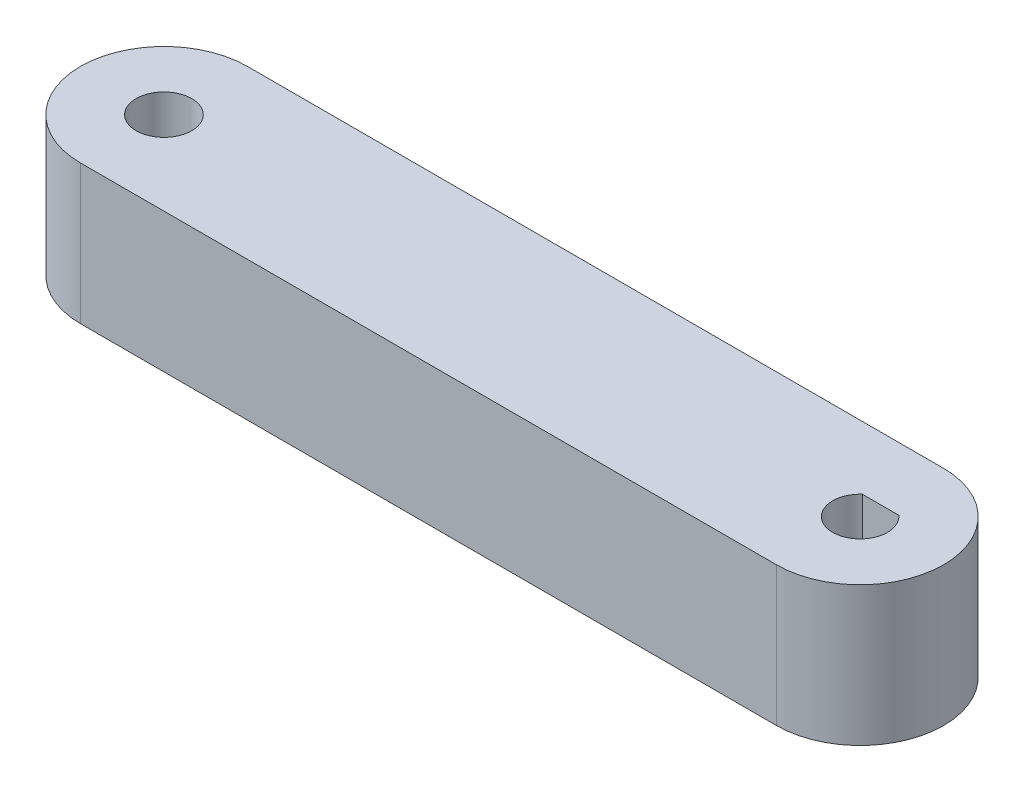
ISO-10303-21;
HEADER;
FILE_DESCRIPTION(('STEP AP214'),'2;1');
FILE_NAME('part.step','',(''),(''),'','','');
FILE_SCHEMA(('AUTOMOTIVE_DESIGN { 1 0 10303 214 1 1 1 1 }'));
ENDSEC;
DATA;
#1=APPLICATION_CONTEXT('core data for automotive mechanical design processes');
#2=APPLICATION_PROTOCOL_DEFINITION('international standard','automotive_design',2000,#1);
#3=PRODUCT_CONTEXT('',#1,'mechanical');
#4=PRODUCT('Part','Part','',(#3));
#5=PRODUCT_RELATED_PRODUCT_CATEGORY('part','',(#4));
#6=PRODUCT_DEFINITION_FORMATION('','',#4);
#7=PRODUCT_DEFINITION_CONTEXT('part definition',#1,'design');
#8=PRODUCT_DEFINITION('design','',#6,#7);
#9=PRODUCT_DEFINITION_SHAPE('','',#8);
#10=(LENGTH_UNIT() NAMED_UNIT(*) SI_UNIT(.MILLI.,.METRE.));
#11=(NAMED_UNIT(*) PLANE_ANGLE_UNIT() SI_UNIT($,.RADIAN.));
#12=(NAMED_UNIT(*) SI_UNIT($,.STERADIAN.) SOLID_ANGLE_UNIT());
#13=UNCERTAINTY_MEASURE_WITH_UNIT(LENGTH_MEASURE(1.E-05),#10,'distance_accuracy_value','');
#14=(GEOMETRIC_REPRESENTATION_CONTEXT(3) GLOBAL_UNCERTAINTY_ASSIGNED_CONTEXT((#13)) GLOBAL_UNIT_ASSIGNED_CONTEXT((#10,
#11,#12)) REPRESENTATION_CONTEXT('',''));
#15=CARTESIAN_POINT('',(0.,0.,0.));
#16=DIRECTION('',(0.,0.,1.));
#17=DIRECTION('',(1.,0.,0.));
#18=AXIS2_PLACEMENT_3D('',#15,#16,#17);
#19=CARTESIAN_POINT('',(-31.75,12.7,0.));
#20=DIRECTION('',(0.,1.,0.));
#21=DIRECTION('',(0.,0.,1.));
#22=AXIS2_PLACEMENT_3D('',#19,#20,#21);
#23=PLANE('',#22);
#24=CARTESIAN_POINT('',(-31.75,12.7,0.));
#25=DIRECTION('',(0.,1.,0.));
#26=DIRECTION('',(0.,0.,1.));
#27=AXIS2_PLACEMENT_3D('',#24,#25,#26);
#28=CIRCLE('',#27,2.54);
#29=CARTESIAN_POINT('',(-31.75,12.7,2.54));
#30=VERTEX_POINT('',#29);
#31=EDGE_CURVE('E106',#30,#30,#28,.T.);
#32=ORIENTED_EDGE('',*,*,#31,.F.);
#33=EDGE_LOOP('',(#32));
#34=FACE_BOUND('',#33,.T.);
#35=CARTESIAN_POINT('',(-31.75,12.7,0.));
#36=DIRECTION('',(0.,1.,0.));
#37=DIRECTION('',(0.,0.,1.));
#38=AXIS2_PLACEMENT_3D('',#35,#36,#37);
#39=CIRCLE('',#38,7.62);
#40=CARTESIAN_POINT('',(-31.75,12.7,-7.62));
#41=VERTEX_POINT('',#40);
#42=CARTESIAN_POINT('',(-31.75,12.7,7.62));
#43=VERTEX_POINT('',#42);
#44=EDGE_CURVE('E114',#41,#43,#39,.T.);
#45=ORIENTED_EDGE('',*,*,#44,.T.);
#46=DIRECTION('',(1.,0.,0.));
#47=VECTOR('',#46,1.);
#48=CARTESIAN_POINT('',(-31.75,12.7,7.62));
#49=LINE('',#48,#47);
#50=CARTESIAN_POINT('',(31.75,12.7,7.62));
#51=VERTEX_POINT('',#50);
#52=EDGE_CURVE('E117',#43,#51,#49,.T.);
#53=ORIENTED_EDGE('',*,*,#52,.T.);
#54=CARTESIAN_POINT('',(31.75,12.7,0.));
#55=DIRECTION('',(0.,1.,0.));
#56=DIRECTION('',(0.,0.,1.));
#57=AXIS2_PLACEMENT_3D('',#54,#55,#56);
#58=CIRCLE('',#57,7.62);
#59=CARTESIAN_POINT('',(31.75,12.7,-7.62));
#60=VERTEX_POINT('',#59);
#61=EDGE_CURVE('E120',#51,#60,#58,.T.);
#62=ORIENTED_EDGE('',*,*,#61,.T.);
#63=DIRECTION('',(-1.,0.,0.));
#64=VECTOR('',#63,1.);
#65=CARTESIAN_POINT('',(-31.75,12.7,-7.62));
#66=LINE('',#65,#64);
#67=EDGE_CURVE('E122',#60,#41,#66,.T.);
#68=ORIENTED_EDGE('',*,*,#67,.T.);
#69=EDGE_LOOP('',(#45,#53,#62,#68));
#70=FACE_BOUND('',#69,.T.);
#71=CARTESIAN_POINT('',(31.75,12.7,0.));
#72=DIRECTION('',(0.,1.,0.));
#73=DIRECTION('',(0.,0.,1.));
#74=AXIS2_PLACEMENT_3D('',#71,#72,#73);
#75=CIRCLE('',#74,2.5);
#76=CARTESIAN_POINT('',(30.0911825098418,12.7,-1.87038085275302));
#77=VERTEX_POINT('',#76);
#78=CARTESIAN_POINT('',(33.4088174901582,12.7,-1.87038085275302));
#79=VERTEX_POINT('',#78);
#80=EDGE_CURVE('E101',#77,#79,#75,.T.);
#81=ORIENTED_EDGE('',*,*,#80,.F.);
#82=DIRECTION('',(1.,0.,0.));
#83=VECTOR('',#82,1.);
#84=CARTESIAN_POINT('',(0.,12.7,-1.87038085275302));
#85=LINE('',#84,#83);
#86=EDGE_CURVE('E53',#77,#79,#85,.T.);
#87=ORIENTED_EDGE('',*,*,#86,.T.);
#88=EDGE_LOOP('',(#81,#87));
#89=FACE_BOUND('',#88,.T.);
#90=ADVANCED_FACE('F38',(#34,#70,#89),#23,.T.);
#91=CARTESIAN_POINT('',(-31.75,0.,0.));
#92=DIRECTION('',(0.,1.,0.));
#93=DIRECTION('',(0.,0.,1.));
#94=AXIS2_PLACEMENT_3D('',#91,#92,#93);
#95=PLANE('',#94);
#96=CARTESIAN_POINT('',(-31.75,0.,0.));
#97=DIRECTION('',(0.,1.,0.));
#98=DIRECTION('',(0.,0.,1.));
#99=AXIS2_PLACEMENT_3D('',#96,#97,#98);
#100=CIRCLE('',#99,7.62);
#101=CARTESIAN_POINT('',(-31.75,0.,-7.62));
#102=VERTEX_POINT('',#101);
#103=CARTESIAN_POINT('',(-31.75,0.,7.62));
#104=VERTEX_POINT('',#103);
#105=EDGE_CURVE('E111',#102,#104,#100,.T.);
#106=ORIENTED_EDGE('',*,*,#105,.F.);
#107=DIRECTION('',(-1.,0.,0.));
#108=VECTOR('',#107,1.);
#109=CARTESIAN_POINT('',(-31.75,0.,-7.62));
#110=LINE('',#109,#108);
#111=CARTESIAN_POINT('',(31.75,0.,-7.62));
#112=VERTEX_POINT('',#111);
#113=EDGE_CURVE('E118',#112,#102,#110,.T.);
#114=ORIENTED_EDGE('',*,*,#113,.F.);
#115=CARTESIAN_POINT('',(31.75,0.,0.));
#116=DIRECTION('',(0.,1.,0.));
#117=DIRECTION('',(0.,0.,1.));
#118=AXIS2_PLACEMENT_3D('',#115,#116,#117);
#119=CIRCLE('',#118,7.62);
#120=CARTESIAN_POINT('',(31.75,0.,7.62));
#121=VERTEX_POINT('',#120);
#122=EDGE_CURVE('E129',#121,#112,#119,.T.);
#123=ORIENTED_EDGE('',*,*,#122,.F.);
#124=DIRECTION('',(1.,0.,0.));
#125=VECTOR('',#124,1.);
#126=CARTESIAN_POINT('',(-31.75,0.,7.62));
#127=LINE('',#126,#125);
#128=EDGE_CURVE('E127',#104,#121,#127,.T.);
#129=ORIENTED_EDGE('',*,*,#128,.F.);
#130=EDGE_LOOP('',(#106,#114,#123,#129));
#131=FACE_BOUND('',#130,.T.);
#132=CARTESIAN_POINT('',(-31.75,0.,0.));
#133=DIRECTION('',(0.,1.,0.));
#134=DIRECTION('',(0.,0.,1.));
#135=AXIS2_PLACEMENT_3D('',#132,#133,#134);
#136=CIRCLE('',#135,2.54);
#137=CARTESIAN_POINT('',(-31.75,0.,2.54));
#138=VERTEX_POINT('',#137);
#139=EDGE_CURVE('E108',#138,#138,#136,.T.);
#140=ORIENTED_EDGE('',*,*,#139,.T.);
#141=EDGE_LOOP('',(#140));
#142=FACE_BOUND('',#141,.T.);
#143=DIRECTION('',(1.,0.,0.));
#144=VECTOR('',#143,1.);
#145=CARTESIAN_POINT('',(0.,0.,-1.87038085275302));
#146=LINE('',#145,#144);
#147=CARTESIAN_POINT('',(30.0911825098418,0.,-1.87038085275302));
#148=VERTEX_POINT('',#147);
#149=CARTESIAN_POINT('',(33.4088174901582,0.,-1.87038085275302));
#150=VERTEX_POINT('',#149);
#151=EDGE_CURVE('E92',#148,#150,#146,.T.);
#152=ORIENTED_EDGE('',*,*,#151,.F.);
#153=CARTESIAN_POINT('',(31.75,0.,0.));
#154=DIRECTION('',(0.,1.,0.));
#155=DIRECTION('',(0.,0.,1.));
#156=AXIS2_PLACEMENT_3D('',#153,#154,#155);
#157=CIRCLE('',#156,2.5);
#158=EDGE_CURVE('E95',#148,#150,#157,.T.);
#159=ORIENTED_EDGE('',*,*,#158,.T.);
#160=EDGE_LOOP('',(#152,#159));
#161=FACE_BOUND('',#160,.T.);
#162=ADVANCED_FACE('F100',(#131,#142,#161),#95,.F.);
#163=CARTESIAN_POINT('',(-31.75,12.7,0.));
#164=DIRECTION('',(0.,-1.,0.));
#165=DIRECTION('',(0.,0.,-1.));
#166=AXIS2_PLACEMENT_3D('',#163,#164,#165);
#167=CYLINDRICAL_SURFACE('',#166,7.62);
#168=ORIENTED_EDGE('',*,*,#105,.T.);
#169=DIRECTION('',(0.,-1.,0.));
#170=VECTOR('',#169,1.);
#171=CARTESIAN_POINT('',(-31.75,12.7,7.62));
#172=LINE('',#171,#170);
#173=EDGE_CURVE('E11',#43,#104,#172,.T.);
#174=ORIENTED_EDGE('',*,*,#173,.F.);
#175=ORIENTED_EDGE('',*,*,#44,.F.);
#176=DIRECTION('',(0.,-1.,0.));
#177=VECTOR('',#176,1.);
#178=CARTESIAN_POINT('',(-31.75,12.7,-7.62));
#179=LINE('',#178,#177);
#180=EDGE_CURVE('E124',#41,#102,#179,.T.);
#181=ORIENTED_EDGE('',*,*,#180,.T.);
#182=EDGE_LOOP('',(#168,#174,#175,#181));
#183=FACE_BOUND('',#182,.T.);
#184=ADVANCED_FACE('F40',(#183),#167,.T.);
#185=CARTESIAN_POINT('',(-31.75,12.7,7.62));
#186=DIRECTION('',(0.,0.,-1.));
#187=DIRECTION('',(-1.,0.,0.));
#188=AXIS2_PLACEMENT_3D('',#185,#186,#187);
#189=PLANE('',#188);
#190=ORIENTED_EDGE('',*,*,#128,.T.);
#191=DIRECTION('',(0.,-1.,0.));
#192=VECTOR('',#191,1.);
#193=CARTESIAN_POINT('',(31.75,12.7,7.62));
#194=LINE('',#193,#192);
#195=EDGE_CURVE('E46',#51,#121,#194,.T.);
#196=ORIENTED_EDGE('',*,*,#195,.F.);
#197=ORIENTED_EDGE('',*,*,#52,.F.);
#198=ORIENTED_EDGE('',*,*,#173,.T.);
#199=EDGE_LOOP('',(#190,#196,#197,#198));
#200=FACE_BOUND('',#199,.T.);
#201=ADVANCED_FACE('F157',(#200),#189,.F.);
#202=CARTESIAN_POINT('',(31.75,12.7,0.));
#203=DIRECTION('',(0.,-1.,0.));
#204=DIRECTION('',(0.,0.,-1.));
#205=AXIS2_PLACEMENT_3D('',#202,#203,#204);
#206=CYLINDRICAL_SURFACE('',#205,7.62);
#207=ORIENTED_EDGE('',*,*,#122,.T.);
#208=DIRECTION('',(0.,-1.,0.));
#209=VECTOR('',#208,1.);
#210=CARTESIAN_POINT('',(31.75,12.7,-7.62));
#211=LINE('',#210,#209);
#212=EDGE_CURVE('E134',#60,#112,#211,.T.);
#213=ORIENTED_EDGE('',*,*,#212,.F.);
#214=ORIENTED_EDGE('',*,*,#61,.F.);
#215=ORIENTED_EDGE('',*,*,#195,.T.);
#216=EDGE_LOOP('',(#207,#213,#214,#215));
#217=FACE_BOUND('',#216,.T.);
#218=ADVANCED_FACE('F141',(#217),#206,.T.);
#219=CARTESIAN_POINT('',(-31.75,12.7,-7.62));
#220=DIRECTION('',(0.,0.,1.));
#221=DIRECTION('',(1.,0.,0.));
#222=AXIS2_PLACEMENT_3D('',#219,#220,#221);
#223=PLANE('',#222);
#224=ORIENTED_EDGE('',*,*,#113,.T.);
#225=ORIENTED_EDGE('',*,*,#180,.F.);
#226=ORIENTED_EDGE('',*,*,#67,.F.);
#227=ORIENTED_EDGE('',*,*,#212,.T.);
#228=EDGE_LOOP('',(#224,#225,#226,#227));
#229=FACE_BOUND('',#228,.T.);
#230=ADVANCED_FACE('F150',(#229),#223,.F.);
#231=CARTESIAN_POINT('',(-31.75,0.,0.));
#232=DIRECTION('',(0.,1.,0.));
#233=DIRECTION('',(0.,0.,1.));
#234=AXIS2_PLACEMENT_3D('',#231,#232,#233);
#235=CYLINDRICAL_SURFACE('',#234,2.54);
#236=ORIENTED_EDGE('',*,*,#139,.F.);
#237=EDGE_LOOP('',(#236));
#238=FACE_BOUND('',#237,.T.);
#239=ORIENTED_EDGE('',*,*,#31,.T.);
#240=EDGE_LOOP('',(#239));
#241=FACE_BOUND('',#240,.T.);
#242=ADVANCED_FACE('F174',(#238,#241),#235,.F.);
#243=CARTESIAN_POINT('',(0.,0.,-1.87038085275302));
#244=DIRECTION('',(0.,0.,1.));
#245=DIRECTION('',(1.,0.,0.));
#246=AXIS2_PLACEMENT_3D('',#243,#244,#245);
#247=PLANE('',#246);
#248=ORIENTED_EDGE('',*,*,#86,.F.);
#249=DIRECTION('',(0.,1.,0.));
#250=VECTOR('',#249,1.);
#251=CARTESIAN_POINT('',(30.0911825098418,0.,-1.87038085275302));
#252=LINE('',#251,#250);
#253=EDGE_CURVE('E89',#148,#77,#252,.T.);
#254=ORIENTED_EDGE('',*,*,#253,.F.);
#255=ORIENTED_EDGE('',*,*,#151,.T.);
#256=DIRECTION('',(0.,1.,0.));
#257=VECTOR('',#256,1.);
#258=CARTESIAN_POINT('',(33.4088174901582,0.,-1.87038085275302));
#259=LINE('',#258,#257);
#260=EDGE_CURVE('E60',#150,#79,#259,.T.);
#261=ORIENTED_EDGE('',*,*,#260,.T.);
#262=EDGE_LOOP('',(#248,#254,#255,#261));
#263=FACE_BOUND('',#262,.T.);
#264=ADVANCED_FACE('F90',(#263),#247,.T.);
#265=CARTESIAN_POINT('',(31.75,0.,0.));
#266=DIRECTION('',(0.,1.,0.));
#267=DIRECTION('',(0.,0.,1.));
#268=AXIS2_PLACEMENT_3D('',#265,#266,#267);
#269=CYLINDRICAL_SURFACE('',#268,2.5);
#270=ORIENTED_EDGE('',*,*,#80,.T.);
#271=ORIENTED_EDGE('',*,*,#260,.F.);
#272=ORIENTED_EDGE('',*,*,#158,.F.);
#273=ORIENTED_EDGE('',*,*,#253,.T.);
#274=EDGE_LOOP('',(#270,#271,#272,#273));
#275=FACE_BOUND('',#274,.T.);
#276=ADVANCED_FACE('F97',(#275),#269,.F.);
#277=CLOSED_SHELL('',(#90,#162,#184,#201,#218,#230,#242,#264,#276));
#278=MANIFOLD_SOLID_BREP('B2',#277);
#279=ADVANCED_BREP_SHAPE_REPRESENTATION('',(#18,#278),#14);
#280=SHAPE_DEFINITION_REPRESENTATION(#9,#279);
ENDSEC;
END-ISO-10303-21;
